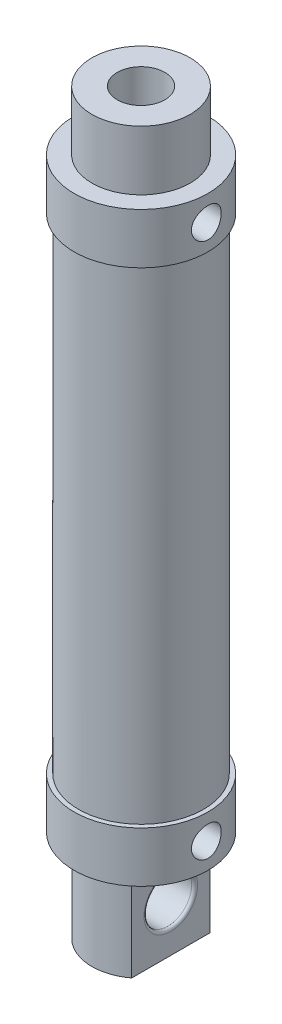
ISO-10303-21;
HEADER;
FILE_DESCRIPTION(('STEP AP214'),'2;1');
FILE_NAME('part.step','',(''),(''),'','','');
FILE_SCHEMA(('AUTOMOTIVE_DESIGN { 1 0 10303 214 1 1 1 1 }'));
ENDSEC;
DATA;
#1=APPLICATION_CONTEXT('core data for automotive mechanical design processes');
#2=APPLICATION_PROTOCOL_DEFINITION('international standard','automotive_design',2000,#1);
#3=PRODUCT_CONTEXT('',#1,'mechanical');
#4=PRODUCT('Part','Part','',(#3));
#5=PRODUCT_RELATED_PRODUCT_CATEGORY('part','',(#4));
#6=PRODUCT_DEFINITION_FORMATION('','',#4);
#7=PRODUCT_DEFINITION_CONTEXT('part definition',#1,'design');
#8=PRODUCT_DEFINITION('design','',#6,#7);
#9=PRODUCT_DEFINITION_SHAPE('','',#8);
#10=(LENGTH_UNIT() NAMED_UNIT(*) SI_UNIT(.MILLI.,.METRE.));
#11=(NAMED_UNIT(*) PLANE_ANGLE_UNIT() SI_UNIT($,.RADIAN.));
#12=(NAMED_UNIT(*) SI_UNIT($,.STERADIAN.) SOLID_ANGLE_UNIT());
#13=UNCERTAINTY_MEASURE_WITH_UNIT(LENGTH_MEASURE(1.E-05),#10,'distance_accuracy_value','');
#14=(GEOMETRIC_REPRESENTATION_CONTEXT(3) GLOBAL_UNCERTAINTY_ASSIGNED_CONTEXT((#13)) GLOBAL_UNIT_ASSIGNED_CONTEXT((#10,
#11,#12)) REPRESENTATION_CONTEXT('',''));
#15=CARTESIAN_POINT('',(0.,0.,0.));
#16=DIRECTION('',(0.,0.,1.));
#17=DIRECTION('',(1.,0.,0.));
#18=AXIS2_PLACEMENT_3D('',#15,#16,#17);
#19=CARTESIAN_POINT('',(0.,180.,0.));
#20=DIRECTION('',(0.,1.,0.));
#21=DIRECTION('',(0.,0.,-1.));
#22=AXIS2_PLACEMENT_3D('',#19,#20,#21);
#23=PLANE('',#22);
#24=CARTESIAN_POINT('',(0.,180.,0.));
#25=DIRECTION('',(0.,-1.,0.));
#26=DIRECTION('',(0.,0.,-1.));
#27=AXIS2_PLACEMENT_3D('',#24,#25,#26);
#28=CIRCLE('',#27,22.5);
#29=CARTESIAN_POINT('',(0.,180.,-22.5));
#30=VERTEX_POINT('',#29);
#31=EDGE_CURVE('E113',#30,#30,#28,.T.);
#32=ORIENTED_EDGE('',*,*,#31,.F.);
#33=EDGE_LOOP('',(#32));
#34=FACE_BOUND('',#33,.T.);
#35=CARTESIAN_POINT('',(0.,180.,0.));
#36=DIRECTION('',(0.,1.,0.));
#37=DIRECTION('',(0.,0.,1.));
#38=AXIS2_PLACEMENT_3D('',#35,#36,#37);
#39=CIRCLE('',#38,16.5);
#40=CARTESIAN_POINT('',(0.,180.,16.5));
#41=VERTEX_POINT('',#40);
#42=EDGE_CURVE('E260',#41,#41,#39,.T.);
#43=ORIENTED_EDGE('',*,*,#42,.F.);
#44=EDGE_LOOP('',(#43));
#45=FACE_BOUND('',#44,.T.);
#46=ADVANCED_FACE('F34',(#34,#45),#23,.T.);
#47=CARTESIAN_POINT('',(0.,-17.,0.));
#48=DIRECTION('',(0.,-1.,0.));
#49=DIRECTION('',(0.,0.,-1.));
#50=AXIS2_PLACEMENT_3D('',#47,#48,#49);
#51=PLANE('',#50);
#52=CARTESIAN_POINT('',(0.,-17.,0.));
#53=DIRECTION('',(0.,-1.,0.));
#54=DIRECTION('',(0.,0.,-1.));
#55=AXIS2_PLACEMENT_3D('',#52,#53,#54);
#56=CIRCLE('',#55,22.5);
#57=CARTESIAN_POINT('',(0.,-17.,-22.5));
#58=VERTEX_POINT('',#57);
#59=EDGE_CURVE('E125',#58,#58,#56,.T.);
#60=ORIENTED_EDGE('',*,*,#59,.T.);
#61=EDGE_LOOP('',(#60));
#62=FACE_BOUND('',#61,.T.);
#63=DIRECTION('',(0.,0.,1.));
#64=VECTOR('',#63,1.);
#65=CARTESIAN_POINT('',(10.,-17.,-13.1244047484067));
#66=LINE('',#65,#64);
#67=CARTESIAN_POINT('',(10.,-17.,-13.1244047484067));
#68=VERTEX_POINT('',#67);
#69=CARTESIAN_POINT('',(10.,-17.,13.1244047484067));
#70=VERTEX_POINT('',#69);
#71=EDGE_CURVE('E90',#68,#70,#66,.T.);
#72=ORIENTED_EDGE('',*,*,#71,.F.);
#73=CARTESIAN_POINT('',(0.,-17.,0.));
#74=DIRECTION('',(0.,-1.,0.));
#75=DIRECTION('',(0.,0.,-1.));
#76=AXIS2_PLACEMENT_3D('',#73,#74,#75);
#77=CIRCLE('',#76,16.5);
#78=CARTESIAN_POINT('',(-10.,-17.,-13.1244047484067));
#79=VERTEX_POINT('',#78);
#80=EDGE_CURVE('E101',#79,#68,#77,.T.);
#81=ORIENTED_EDGE('',*,*,#80,.F.);
#82=DIRECTION('',(0.,0.,-1.));
#83=VECTOR('',#82,1.);
#84=CARTESIAN_POINT('',(-10.,-17.,-13.1244047484067));
#85=LINE('',#84,#83);
#86=CARTESIAN_POINT('',(-10.,-17.,13.1244047484067));
#87=VERTEX_POINT('',#86);
#88=EDGE_CURVE('E71',#87,#79,#85,.T.);
#89=ORIENTED_EDGE('',*,*,#88,.F.);
#90=CARTESIAN_POINT('',(0.,-17.,0.));
#91=DIRECTION('',(0.,-1.,0.));
#92=DIRECTION('',(0.,0.,-1.));
#93=AXIS2_PLACEMENT_3D('',#90,#91,#92);
#94=CIRCLE('',#93,16.5);
#95=EDGE_CURVE('E106',#70,#87,#94,.T.);
#96=ORIENTED_EDGE('',*,*,#95,.F.);
#97=EDGE_LOOP('',(#72,#81,#89,#96));
#98=FACE_BOUND('',#97,.T.);
#99=ADVANCED_FACE('F163',(#62,#98),#51,.T.);
#100=CARTESIAN_POINT('',(0.,180.,0.));
#101=DIRECTION('',(0.,-1.,0.));
#102=DIRECTION('',(0.,0.,-1.));
#103=AXIS2_PLACEMENT_3D('',#100,#101,#102);
#104=CYLINDRICAL_SURFACE('',#103,22.5);
#105=ORIENTED_EDGE('',*,*,#31,.T.);
#106=EDGE_LOOP('',(#105));
#107=FACE_BOUND('',#106,.T.);
#108=CARTESIAN_POINT('',(0.,163.,0.));
#109=DIRECTION('',(0.,-1.,0.));
#110=DIRECTION('',(0.,0.,-1.));
#111=AXIS2_PLACEMENT_3D('',#108,#109,#110);
#112=CIRCLE('',#111,22.5);
#113=CARTESIAN_POINT('',(0.,163.,-22.5));
#114=VERTEX_POINT('',#113);
#115=EDGE_CURVE('E112',#114,#114,#112,.T.);
#116=ORIENTED_EDGE('',*,*,#115,.F.);
#117=EDGE_LOOP('',(#116));
#118=FACE_BOUND('',#117,.T.);
#119=CARTESIAN_POINT('',(21.9374109684803,171.5,-5.));
#120=CARTESIAN_POINT('',(21.9374165661433,171.22289408071,-4.99999062369871));
#121=CARTESIAN_POINT('',(21.942718633996,170.945676468354,-4.97688532864164));
#122=CARTESIAN_POINT('',(21.9633134762853,170.399132934778,-4.88518059165713));
#123=CARTESIAN_POINT('',(21.9786133234432,170.12981274146,-4.81654894253562));
#124=CARTESIAN_POINT('',(22.0173873094191,169.607048944326,-4.63606595780698));
#125=CARTESIAN_POINT('',(22.0408523106148,169.353587964999,-4.52426292001524));
#126=CARTESIAN_POINT('',(22.0933016577055,168.869012482357,-4.26075008588277));
#127=CARTESIAN_POINT('',(22.1222859274126,168.637897670643,-4.1090408403953));
#128=CARTESIAN_POINT('',(22.1830725820844,168.200543571579,-3.76720268647807));
#129=CARTESIAN_POINT('',(22.2149119956476,167.994750594701,-3.57650924448048));
#130=CARTESIAN_POINT('',(22.277497586179,167.617793118902,-3.16333419715912));
#131=CARTESIAN_POINT('',(22.3082436762984,167.446631365891,-2.94085007353794));
#132=CARTESIAN_POINT('',(22.3655823200431,167.142023121512,-2.46740986309392));
#133=CARTESIAN_POINT('',(22.3921260851858,167.009006876367,-2.2161705413327));
#134=CARTESIAN_POINT('',(22.4376506083871,166.787250495699,-1.69421583912987));
#135=CARTESIAN_POINT('',(22.4566322429044,166.698505228822,-1.42350272001739));
#136=CARTESIAN_POINT('',(22.4846321116813,166.569216417653,-0.874926990820835));
#137=CARTESIAN_POINT('',(22.4938063731733,166.527917226999,-0.597250570654805));
#138=CARTESIAN_POINT('',(22.501698723801,166.492329322819,-0.0387691444650578));
#139=CARTESIAN_POINT('',(22.5004180460737,166.498035065165,0.242035488691364));
#140=CARTESIAN_POINT('',(22.4876637337819,166.55573430624,0.79358980233586));
#141=CARTESIAN_POINT('',(22.4763694901164,166.606913197728,1.06442946081786));
#142=CARTESIAN_POINT('',(22.4450619325581,166.752806668888,1.59357711385855));
#143=CARTESIAN_POINT('',(22.4250482162022,166.847523258133,1.85188452935707));
#144=CARTESIAN_POINT('',(22.3782634651396,167.078517435252,2.35088442347728));
#145=CARTESIAN_POINT('',(22.3514428138133,167.215101791361,2.59143005223487));
#146=CARTESIAN_POINT('',(22.293981792107,167.525725234873,3.04648284136218));
#147=CARTESIAN_POINT('',(22.2633408860234,167.699769577676,3.26098634157449));
#148=CARTESIAN_POINT('',(22.2008291431457,168.084800484631,3.66271247395139));
#149=CARTESIAN_POINT('',(22.1689460239096,168.296499939921,3.84925054618799));
#150=CARTESIAN_POINT('',(22.1081580361397,168.748506869048,4.18430757551619));
#151=CARTESIAN_POINT('',(22.0792532537017,168.988815169457,4.3328254337298));
#152=CARTESIAN_POINT('',(22.027660838775,169.492349720856,4.58794414789231));
#153=CARTESIAN_POINT('',(22.0049930107585,169.755645556943,4.69441193598692));
#154=CARTESIAN_POINT('',(21.9687128511933,170.297015428135,4.86138173804741));
#155=CARTESIAN_POINT('',(21.9550990318597,170.575087027123,4.92189130425381));
#156=CARTESIAN_POINT('',(21.9387727122218,171.131849967674,4.99415747251352));
#157=CARTESIAN_POINT('',(21.9358370046809,171.410405327621,5.00691246919605));
#158=CARTESIAN_POINT('',(21.9405966113852,171.965662307414,4.98601368560592));
#159=CARTESIAN_POINT('',(21.9482911698352,172.242364057643,4.95236320469018));
#160=CARTESIAN_POINT('',(21.973233207339,172.782558843734,4.84047593306879));
#161=CARTESIAN_POINT('',(21.9903620918494,173.046172438239,4.7627923163612));
#162=CARTESIAN_POINT('',(22.0321352125226,173.556641577824,4.56564437846772));
#163=CARTESIAN_POINT('',(22.0567801869623,173.803495473749,4.44617595275022));
#164=CARTESIAN_POINT('',(22.1112968513251,174.277749004441,4.1666617541638));
#165=CARTESIAN_POINT('',(22.1412451911085,174.504778287463,4.00600286177112));
#166=CARTESIAN_POINT('',(22.2027935503206,174.929020893522,3.64946760734427));
#167=CARTESIAN_POINT('',(22.2343937814343,175.126230382571,3.45358672382732));
#168=CARTESIAN_POINT('',(22.2964233481837,175.489128358771,3.02764303653655));
#169=CARTESIAN_POINT('',(22.3268183182885,175.654135089674,2.79699352459069));
#170=CARTESIAN_POINT('',(22.3823727860854,175.943060335585,2.31067040535647));
#171=CARTESIAN_POINT('',(22.4075325323521,176.066980801584,2.05499798703266));
#172=CARTESIAN_POINT('',(22.4496372179897,176.269275286584,1.52750475000824));
#173=CARTESIAN_POINT('',(22.4666350054648,176.347942989735,1.25580097043602));
#174=CARTESIAN_POINT('',(22.4907294174878,176.458412900041,0.702612716988976));
#175=CARTESIAN_POINT('',(22.4978275303209,176.490222151785,0.421129719812964));
#176=CARTESIAN_POINT('',(22.501276880007,176.505746955922,-0.137162113850936));
#177=CARTESIAN_POINT('',(22.4978552807622,176.490479076648,-0.413941764340498));
#178=CARTESIAN_POINT('',(22.481138161578,176.414562623608,-0.960885103415379));
#179=CARTESIAN_POINT('',(22.4678428303716,176.353914917262,-1.23104891835823));
#180=CARTESIAN_POINT('',(22.4328909266112,176.189454107013,-1.75627571196661));
#181=CARTESIAN_POINT('',(22.4112631248155,176.085789440248,-2.01138720660136));
#182=CARTESIAN_POINT('',(22.3619521829452,175.838380491151,-2.50072882023259));
#183=CARTESIAN_POINT('',(22.3342684349331,175.694632184549,-2.73495683947676));
#184=CARTESIAN_POINT('',(22.2751870653884,175.367844306342,-3.18082724877494));
#185=CARTESIAN_POINT('',(22.2437274871573,175.184092410776,-3.39193939598233));
#186=CARTESIAN_POINT('',(22.1809676794422,174.783944658869,-3.78067933088269));
#187=CARTESIAN_POINT('',(22.1496674903786,174.567540910525,-3.95829899997864));
#188=CARTESIAN_POINT('',(22.0902842541619,174.10461375053,-4.27739627854961));
#189=CARTESIAN_POINT('',(22.0622519776713,173.857713458148,-4.41833714644939));
#190=CARTESIAN_POINT('',(22.0132210046623,173.343157761572,-4.65650065811668));
#191=CARTESIAN_POINT('',(21.9922164448483,173.075519889736,-4.75375976933249));
#192=CARTESIAN_POINT('',(21.9634405435101,172.589733814862,-4.88473373664338));
#193=CARTESIAN_POINT('',(21.9537451128599,172.374191431816,-4.92787455119963));
#194=CARTESIAN_POINT('',(21.9407282728786,171.93912260855,-4.98551065426522));
#195=CARTESIAN_POINT('',(21.9374065325357,171.719596375824,-5.0000074303782));
#196=CARTESIAN_POINT('',(21.9374109684803,171.5,-5.));
#197=B_SPLINE_CURVE_WITH_KNOTS('',3,(#119,#120,#121,#122,#123,#124,#125,#126,#127,#128,#129,
#130,#131,#132,#133,#134,#135,#136,#137,#138,#139,#140,#141,#142,#143,#144,#145,#146,#147,#148,
#149,#150,#151,#152,#153,#154,#155,#156,#157,#158,#159,#160,#161,#162,#163,#164,#165,#166,#167,
#168,#169,#170,#171,#172,#173,#174,#175,#176,#177,#178,#179,#180,#181,#182,#183,#184,#185,#186,
#187,#188,#189,#190,#191,#192,#193,#194,#195,#196),.UNSPECIFIED.,.T.,.F.,(4,2,2,2,2,2,2,2,2,2,2,
2,2,2,2,2,2,2,2,2,2,2,2,2,2,2,2,2,2,2,2,2,2,2,2,2,2,2,4),(0.,0.830512792551669,1.66161375111474,
2.49178760019456,3.32194999040622,4.16511484799107,5.00834653390753,5.86074531607021,
6.71304527558167,7.55157428697474,8.39000439715204,9.21371104602281,10.0374557186008,
10.8673864501624,11.6974336917522,12.5453011824495,13.3931931758434,14.2437472362749,
15.0941614962701,15.9266937379832,16.759166791007,17.5814064488659,18.403726898214,
19.239080718276,20.0745418502129,20.9261261511868,21.7776700087199,22.6236232364894,
23.4694492726586,24.29713968923,25.1248142851825,25.9496562945819,26.7745811453329,
27.6156117364682,28.4568459325905,29.309774288485,30.1619892526914,30.8201746575815,
31.4783258792768),.UNSPECIFIED.);
#198=CARTESIAN_POINT('',(21.9374109684803,171.5,-5.));
#199=VERTEX_POINT('',#198);
#200=EDGE_CURVE('E146',#199,#199,#197,.T.);
#201=ORIENTED_EDGE('',*,*,#200,.T.);
#202=EDGE_LOOP('',(#201));
#203=FACE_BOUND('',#202,.T.);
#204=ADVANCED_FACE('F165',(#107,#118,#203),#104,.T.);
#205=CARTESIAN_POINT('',(0.,163.,0.));
#206=DIRECTION('',(0.,-1.,0.));
#207=DIRECTION('',(0.,0.,-1.));
#208=AXIS2_PLACEMENT_3D('',#205,#206,#207);
#209=CYLINDRICAL_SURFACE('',#208,21.);
#210=CARTESIAN_POINT('',(0.,163.,0.));
#211=DIRECTION('',(0.,1.,0.));
#212=DIRECTION('',(0.,0.,1.));
#213=AXIS2_PLACEMENT_3D('',#210,#211,#212);
#214=CIRCLE('',#213,21.);
#215=CARTESIAN_POINT('',(0.,163.,21.));
#216=VERTEX_POINT('',#215);
#217=EDGE_CURVE('E136',#216,#216,#214,.T.);
#218=ORIENTED_EDGE('',*,*,#217,.F.);
#219=EDGE_LOOP('',(#218));
#220=FACE_BOUND('',#219,.T.);
#221=CARTESIAN_POINT('',(0.,0.,0.));
#222=DIRECTION('',(0.,-1.,0.));
#223=DIRECTION('',(0.,0.,-1.));
#224=AXIS2_PLACEMENT_3D('',#221,#222,#223);
#225=CIRCLE('',#224,21.);
#226=CARTESIAN_POINT('',(0.,0.,-21.));
#227=VERTEX_POINT('',#226);
#228=EDGE_CURVE('E128',#227,#227,#225,.T.);
#229=ORIENTED_EDGE('',*,*,#228,.F.);
#230=EDGE_LOOP('',(#229));
#231=FACE_BOUND('',#230,.T.);
#232=ADVANCED_FACE('F183',(#220,#231),#209,.T.);
#233=CARTESIAN_POINT('',(0.,0.,0.));
#234=DIRECTION('',(0.,-1.,0.));
#235=DIRECTION('',(0.,0.,-1.));
#236=AXIS2_PLACEMENT_3D('',#233,#234,#235);
#237=PLANE('',#236);
#238=CARTESIAN_POINT('',(0.,0.,0.));
#239=DIRECTION('',(0.,-1.,0.));
#240=DIRECTION('',(0.,0.,-1.));
#241=AXIS2_PLACEMENT_3D('',#238,#239,#240);
#242=CIRCLE('',#241,22.5);
#243=CARTESIAN_POINT('',(0.,0.,-22.5));
#244=VERTEX_POINT('',#243);
#245=EDGE_CURVE('E124',#244,#244,#242,.T.);
#246=ORIENTED_EDGE('',*,*,#245,.F.);
#247=EDGE_LOOP('',(#246));
#248=FACE_BOUND('',#247,.T.);
#249=ORIENTED_EDGE('',*,*,#228,.T.);
#250=EDGE_LOOP('',(#249));
#251=FACE_BOUND('',#250,.T.);
#252=ADVANCED_FACE('F172',(#248,#251),#237,.F.);
#253=CARTESIAN_POINT('',(0.,-17.,0.));
#254=DIRECTION('',(0.,1.,0.));
#255=DIRECTION('',(0.,0.,1.));
#256=AXIS2_PLACEMENT_3D('',#253,#254,#255);
#257=CYLINDRICAL_SURFACE('',#256,22.5);
#258=CARTESIAN_POINT('',(21.9374109684803,-8.5,-5.));
#259=CARTESIAN_POINT('',(21.9374165661433,-8.77710591928998,-4.99999062369871));
#260=CARTESIAN_POINT('',(21.942718633996,-9.0543235316462,-4.97688532864164));
#261=CARTESIAN_POINT('',(21.9633134762853,-9.60086706522218,-4.88518059165714));
#262=CARTESIAN_POINT('',(21.9786133234432,-9.87018725853995,-4.81654894253563));
#263=CARTESIAN_POINT('',(22.0173873094191,-10.3929510556742,-4.63606595780699));
#264=CARTESIAN_POINT('',(22.0408523106148,-10.646412035001,-4.52426292001524));
#265=CARTESIAN_POINT('',(22.0933016577055,-11.1309875176428,-4.26075008588278));
#266=CARTESIAN_POINT('',(22.1222859274126,-11.3621023293574,-4.1090408403953));
#267=CARTESIAN_POINT('',(22.1830725820844,-11.799456428421,-3.76720268647808));
#268=CARTESIAN_POINT('',(22.2149119956476,-12.0052494052993,-3.57650924448049));
#269=CARTESIAN_POINT('',(22.277497586179,-12.3822068810976,-3.16333419715912));
#270=CARTESIAN_POINT('',(22.3082436762984,-12.5533686341091,-2.94085007353794));
#271=CARTESIAN_POINT('',(22.3655823200431,-12.8579768784883,-2.46740986309391));
#272=CARTESIAN_POINT('',(22.3921260851858,-12.9909931236328,-2.21617054133269));
#273=CARTESIAN_POINT('',(22.4376506083871,-13.2127495043012,-1.69421583912986));
#274=CARTESIAN_POINT('',(22.4566322429044,-13.3014947711775,-1.42350272001738));
#275=CARTESIAN_POINT('',(22.4846321116813,-13.4307835823471,-0.874926990820837));
#276=CARTESIAN_POINT('',(22.4938063731733,-13.472082773001,-0.597250570654805));
#277=CARTESIAN_POINT('',(22.501698723801,-13.5076706771811,-0.0387691444650559));
#278=CARTESIAN_POINT('',(22.5004180460737,-13.5019649348345,0.242035488691367));
#279=CARTESIAN_POINT('',(22.4876637337819,-13.4442656937599,0.793589802335865));
#280=CARTESIAN_POINT('',(22.4763694901164,-13.3930868022723,1.06442946081787));
#281=CARTESIAN_POINT('',(22.4450619325581,-13.2471933311121,1.59357711385856));
#282=CARTESIAN_POINT('',(22.4250482162021,-13.1524767418668,1.85188452935707));
#283=CARTESIAN_POINT('',(22.3782634651396,-12.9214825647477,2.35088442347728));
#284=CARTESIAN_POINT('',(22.3514428138133,-12.7848982086393,2.59143005223488));
#285=CARTESIAN_POINT('',(22.293981792107,-12.4742747651271,3.0464828413622));
#286=CARTESIAN_POINT('',(22.2633408860234,-12.3002304223236,3.2609863415745));
#287=CARTESIAN_POINT('',(22.2008291431457,-11.9151995153691,3.6627124739514));
#288=CARTESIAN_POINT('',(22.1689460239096,-11.7035000600785,3.849250546188));
#289=CARTESIAN_POINT('',(22.1081580361397,-11.2514931309517,4.1843075755162));
#290=CARTESIAN_POINT('',(22.0792532537017,-11.0111848305433,4.3328254337298));
#291=CARTESIAN_POINT('',(22.027660838775,-10.5076502791445,4.58794414789231));
#292=CARTESIAN_POINT('',(22.0049930107585,-10.2443544430568,4.69441193598692));
#293=CARTESIAN_POINT('',(21.9687128511933,-9.70298457186509,4.86138173804741));
#294=CARTESIAN_POINT('',(21.9550990318597,-9.42491297287739,4.92189130425381));
#295=CARTESIAN_POINT('',(21.9387727122218,-8.86815003232613,4.99415747251352));
#296=CARTESIAN_POINT('',(21.9358370046809,-8.5895946723793,5.00691246919605));
#297=CARTESIAN_POINT('',(21.9405966113852,-8.03433769258617,4.98601368560592));
#298=CARTESIAN_POINT('',(21.9482911698352,-7.75763594235657,4.95236320469018));
#299=CARTESIAN_POINT('',(21.973233207339,-7.21744115626593,4.84047593306879));
#300=CARTESIAN_POINT('',(21.9903620918494,-6.95382756176125,4.76279231636121));
#301=CARTESIAN_POINT('',(22.0321352125226,-6.44335842217631,4.56564437846772));
#302=CARTESIAN_POINT('',(22.0567801869623,-6.19650452625082,4.44617595275022));
#303=CARTESIAN_POINT('',(22.1112968513251,-5.72225099555949,4.1666617541638));
#304=CARTESIAN_POINT('',(22.1412451911085,-5.49522171253748,4.00600286177112));
#305=CARTESIAN_POINT('',(22.2027935503206,-5.07097910647812,3.64946760734428));
#306=CARTESIAN_POINT('',(22.2343937814343,-4.87376961742851,3.45358672382733));
#307=CARTESIAN_POINT('',(22.2964233481837,-4.51087164122856,3.02764303653655));
#308=CARTESIAN_POINT('',(22.3268183182885,-4.34586491032636,2.79699352459069));
#309=CARTESIAN_POINT('',(22.3823727860854,-4.05693966441495,2.31067040535647));
#310=CARTESIAN_POINT('',(22.4075325323521,-3.93301919841639,2.05499798703265));
#311=CARTESIAN_POINT('',(22.4496372179897,-3.73072471341648,1.52750475000824));
#312=CARTESIAN_POINT('',(22.4666350054648,-3.65205701026459,1.25580097043601));
#313=CARTESIAN_POINT('',(22.4907294174878,-3.54158709995867,0.702612716988973));
#314=CARTESIAN_POINT('',(22.4978275303209,-3.50977784821539,0.421129719812965));
#315=CARTESIAN_POINT('',(22.501276880007,-3.4942530440776,-0.137162113850932));
#316=CARTESIAN_POINT('',(22.4978552807622,-3.50952092335184,-0.413941764340495));
#317=CARTESIAN_POINT('',(22.481138161578,-3.58543737639187,-0.960885103415378));
#318=CARTESIAN_POINT('',(22.4678428303716,-3.64608508273759,-1.23104891835822));
#319=CARTESIAN_POINT('',(22.4328909266112,-3.81054589298678,-1.75627571196661));
#320=CARTESIAN_POINT('',(22.4112631248155,-3.91421055975179,-2.01138720660136));
#321=CARTESIAN_POINT('',(22.3619521829452,-4.16161950884863,-2.50072882023259));
#322=CARTESIAN_POINT('',(22.3342684349331,-4.30536781545056,-2.73495683947675));
#323=CARTESIAN_POINT('',(22.2751870653884,-4.63215569365768,-3.18082724877495));
#324=CARTESIAN_POINT('',(22.2437274871573,-4.81590758922361,-3.39193939598236));
#325=CARTESIAN_POINT('',(22.1809676794422,-5.21605534113089,-3.78067933088271));
#326=CARTESIAN_POINT('',(22.1496674903786,-5.43245908947523,-3.95829899997864));
#327=CARTESIAN_POINT('',(22.0902842541619,-5.89538624946988,-4.2773962785496));
#328=CARTESIAN_POINT('',(22.0622519776713,-6.14228654185171,-4.41833714644937));
#329=CARTESIAN_POINT('',(22.0132210046623,-6.65684223842792,-4.65650065811667));
#330=CARTESIAN_POINT('',(21.9922164448483,-6.92448011026414,-4.75375976933248));
#331=CARTESIAN_POINT('',(21.9634405435101,-7.41026618513813,-4.88473373664338));
#332=CARTESIAN_POINT('',(21.9537451128599,-7.62580856818372,-4.92787455119963));
#333=CARTESIAN_POINT('',(21.9407282728786,-8.06087739145043,-4.98551065426522));
#334=CARTESIAN_POINT('',(21.9374065325357,-8.28040362417614,-5.0000074303782));
#335=CARTESIAN_POINT('',(21.9374109684803,-8.5,-5.));
#336=B_SPLINE_CURVE_WITH_KNOTS('',3,(#258,#259,#260,#261,#262,#263,#264,#265,#266,#267,#268,
#269,#270,#271,#272,#273,#274,#275,#276,#277,#278,#279,#280,#281,#282,#283,#284,#285,#286,#287,
#288,#289,#290,#291,#292,#293,#294,#295,#296,#297,#298,#299,#300,#301,#302,#303,#304,#305,#306,
#307,#308,#309,#310,#311,#312,#313,#314,#315,#316,#317,#318,#319,#320,#321,#322,#323,#324,#325,
#326,#327,#328,#329,#330,#331,#332,#333,#334,#335),.UNSPECIFIED.,.T.,.F.,(4,2,2,2,2,2,2,2,2,2,2,
2,2,2,2,2,2,2,2,2,2,2,2,2,2,2,2,2,2,2,2,2,2,2,2,2,2,2,4),(0.,0.830512792551633,1.66161375111474,
2.49178760019452,3.3219499904062,4.16511484799107,5.00834653390754,5.86074531607022,
6.71304527558167,7.55157428697474,8.39000439715204,9.21371104602282,10.0374557186008,
10.8673864501624,11.6974336917522,12.5453011824495,13.3931931758434,14.2437472362749,
15.0941614962701,15.9266937379832,16.759166791007,17.5814064488659,18.403726898214,
19.239080718276,20.0745418502128,20.9261261511868,21.7776700087199,22.6236232364894,
23.4694492726586,24.29713968923,25.1248142851825,25.9496562945819,26.7745811453329,
27.6156117364682,28.4568459325905,29.3097742884849,30.1619892526914,30.8201746575815,
31.4783258792768),.UNSPECIFIED.);
#337=CARTESIAN_POINT('',(21.9374109684803,-8.5,-5.));
#338=VERTEX_POINT('',#337);
#339=EDGE_CURVE('E139',#338,#338,#336,.T.);
#340=ORIENTED_EDGE('',*,*,#339,.T.);
#341=EDGE_LOOP('',(#340));
#342=FACE_BOUND('',#341,.T.);
#343=ORIENTED_EDGE('',*,*,#59,.F.);
#344=EDGE_LOOP('',(#343));
#345=FACE_BOUND('',#344,.T.);
#346=ORIENTED_EDGE('',*,*,#245,.T.);
#347=EDGE_LOOP('',(#346));
#348=FACE_BOUND('',#347,.T.);
#349=ADVANCED_FACE('F152',(#342,#345,#348),#257,.T.);
#350=CARTESIAN_POINT('',(5.5,-8.5,0.));
#351=DIRECTION('',(1.,0.,0.));
#352=DIRECTION('',(0.,0.,-1.));
#353=AXIS2_PLACEMENT_3D('',#350,#351,#352);
#354=CYLINDRICAL_SURFACE('',#353,5.);
#355=CARTESIAN_POINT('',(5.5,-8.5,0.));
#356=DIRECTION('',(1.,0.,0.));
#357=DIRECTION('',(0.,0.,-1.));
#358=AXIS2_PLACEMENT_3D('',#355,#356,#357);
#359=CIRCLE('',#358,5.);
#360=CARTESIAN_POINT('',(5.5,-8.5,-5.));
#361=VERTEX_POINT('',#360);
#362=EDGE_CURVE('E121',#361,#361,#359,.T.);
#363=ORIENTED_EDGE('',*,*,#362,.F.);
#364=EDGE_LOOP('',(#363));
#365=FACE_BOUND('',#364,.T.);
#366=ORIENTED_EDGE('',*,*,#339,.F.);
#367=EDGE_LOOP('',(#366));
#368=FACE_BOUND('',#367,.T.);
#369=ADVANCED_FACE('F156',(#365,#368),#354,.F.);
#370=CARTESIAN_POINT('',(5.5,-8.5,0.));
#371=DIRECTION('',(1.,0.,0.));
#372=DIRECTION('',(0.,0.,-1.));
#373=AXIS2_PLACEMENT_3D('',#370,#371,#372);
#374=PLANE('',#373);
#375=ORIENTED_EDGE('',*,*,#362,.T.);
#376=EDGE_LOOP('',(#375));
#377=FACE_BOUND('',#376,.T.);
#378=ADVANCED_FACE('F161',(#377),#374,.T.);
#379=CARTESIAN_POINT('',(0.,163.,0.));
#380=DIRECTION('',(0.,1.,0.));
#381=DIRECTION('',(0.,0.,-1.));
#382=AXIS2_PLACEMENT_3D('',#379,#380,#381);
#383=PLANE('',#382);
#384=ORIENTED_EDGE('',*,*,#115,.T.);
#385=EDGE_LOOP('',(#384));
#386=FACE_BOUND('',#385,.T.);
#387=ORIENTED_EDGE('',*,*,#217,.T.);
#388=EDGE_LOOP('',(#387));
#389=FACE_BOUND('',#388,.T.);
#390=ADVANCED_FACE('F198',(#386,#389),#383,.F.);
#391=CARTESIAN_POINT('',(5.5,171.5,0.));
#392=DIRECTION('',(1.,0.,0.));
#393=DIRECTION('',(0.,0.,-1.));
#394=AXIS2_PLACEMENT_3D('',#391,#392,#393);
#395=CYLINDRICAL_SURFACE('',#394,5.);
#396=CARTESIAN_POINT('',(6.2449979983984,171.5,-5.));
#397=CARTESIAN_POINT('',(6.24499999083318,171.375690002915,-4.99999874728376));
#398=CARTESIAN_POINT('',(6.24872594235152,171.251356088078,-4.99535477639502));
#399=CARTESIAN_POINT('',(6.26346233698877,171.003757654782,-4.97686385741702));
#400=CARTESIAN_POINT('',(6.27447707053878,170.880493809526,-4.96301148892208));
#401=CARTESIAN_POINT('',(6.30332817855701,170.635867105892,-4.92631685582623));
#402=CARTESIAN_POINT('',(6.32117831167981,170.514508598929,-4.90345645667282));
#403=CARTESIAN_POINT('',(6.36295500797281,170.274781539973,-4.84912073775945));
#404=CARTESIAN_POINT('',(6.38688460836052,170.156414515075,-4.81764111134032));
#405=CARTESIAN_POINT('',(6.4659871046767,169.80901714823,-4.71155634327381));
#406=CARTESIAN_POINT('',(6.52878844336902,169.585278408658,-4.6249307188155));
#407=CARTESIAN_POINT('',(6.66732308206753,169.155923708948,-4.42286683667303));
#408=CARTESIAN_POINT('',(6.7430567348088,168.950308243362,-4.30742779304937));
#409=CARTESIAN_POINT('',(6.91118002626908,168.532558586983,-4.03296948836379));
#410=CARTESIAN_POINT('',(7.00444112628931,168.323250470494,-3.87018134056584));
#411=CARTESIAN_POINT('',(7.19012524520994,167.93243974347,-3.51319765959104));
#412=CARTESIAN_POINT('',(7.28254746874407,167.750961359507,-3.3189750607162));
#413=CARTESIAN_POINT('',(7.41988971846401,167.492393738508,-2.99356128179165));
#414=CARTESIAN_POINT('',(7.46785190700924,167.404451706583,-2.87212880091628));
#415=CARTESIAN_POINT('',(7.55971876275305,167.239240482827,-2.62078661715025));
#416=CARTESIAN_POINT('',(7.60362512973125,167.161966813148,-2.49088050482954));
#417=CARTESIAN_POINT('',(7.68611478127736,167.018954631685,-2.2233377181538));
#418=CARTESIAN_POINT('',(7.72470066932016,166.953210473842,-2.08570487145726));
#419=CARTESIAN_POINT('',(7.79539753077302,166.834110863599,-1.80358193532005));
#420=CARTESIAN_POINT('',(7.82750968154026,166.780753158248,-1.65909309867122));
#421=CARTESIAN_POINT('',(7.88132879110576,166.692042581308,-1.37943032429725));
#422=CARTESIAN_POINT('',(7.90376135583818,166.655411358032,-1.24480106420071));
#423=CARTESIAN_POINT('',(7.94191844310851,166.593405724506,-0.972050692903721));
#424=CARTESIAN_POINT('',(7.95764407963578,166.568029444833,-0.83393016562646));
#425=CARTESIAN_POINT('',(7.98191012055643,166.528971611758,-0.555534462309639));
#426=CARTESIAN_POINT('',(7.9904564434862,166.515280425163,-0.415261158337205));
#427=CARTESIAN_POINT('',(8.00011955525847,166.499804914647,-0.133810084943788));
#428=CARTESIAN_POINT('',(8.00123719925945,166.498019220217,0.00736757849819063));
#429=CARTESIAN_POINT('',(7.99636544353032,166.50581693158,0.270239609899357));
#430=CARTESIAN_POINT('',(7.99131217584322,166.513902772159,0.391999310072914));
#431=CARTESIAN_POINT('',(7.97573898833037,166.538900493108,0.634293592306118));
#432=CARTESIAN_POINT('',(7.96521743178982,166.555815016,0.754827796543408));
#433=CARTESIAN_POINT('',(7.93894787928476,166.598248043326,0.993750416290279));
#434=CARTESIAN_POINT('',(7.92320165200919,166.623763636118,1.11213954368101));
#435=CARTESIAN_POINT('',(7.88683283084566,166.683084639958,1.34607315554104));
#436=CARTESIAN_POINT('',(7.86620835217572,166.716893255322,1.46161652141071));
#437=CARTESIAN_POINT('',(7.79753837345255,166.830385932127,1.80341623892685));
#438=CARTESIAN_POINT('',(7.74273886956258,166.922069927087,2.02447250488059));
#439=CARTESIAN_POINT('',(7.6194209119633,167.133884392283,2.44811588786113));
#440=CARTESIAN_POINT('',(7.55089933332868,167.254021343246,2.65069878262929));
#441=CARTESIAN_POINT('',(7.39573414184525,167.536103319765,3.05883635403528));
#442=CARTESIAN_POINT('',(7.30789649394851,167.701390664535,3.2616234577039));
#443=CARTESIAN_POINT('',(7.12780216070677,168.060557403349,3.63842034253162));
#444=CARTESIAN_POINT('',(7.0355391870356,168.254478349966,3.8123875088261));
#445=CARTESIAN_POINT('',(6.89398778931582,168.578001939642,4.05999923159468));
#446=CARTESIAN_POINT('',(6.8434352903873,168.698968467453,4.14440430037546));
#447=CARTESIAN_POINT('',(6.74504990142271,168.948748859913,4.30267035241459));
#448=CARTESIAN_POINT('',(6.697217523353,169.077564192433,4.37652935467604));
#449=CARTESIAN_POINT('',(6.60608014442446,169.342290734318,4.51291782494083));
#450=CARTESIAN_POINT('',(6.5627675425284,169.478189434639,4.57546644816389));
#451=CARTESIAN_POINT('',(6.48238923774269,169.756692317556,4.68865167394018));
#452=CARTESIAN_POINT('',(6.44532349757937,169.899296460135,4.73928834757019));
#453=CARTESIAN_POINT('',(6.3879911088914,170.151915844484,4.81614194168603));
#454=CARTESIAN_POINT('',(6.36587062744548,170.260629894668,4.84527833481626));
#455=CARTESIAN_POINT('',(6.3267200135842,170.480640997988,4.89628944573215));
#456=CARTESIAN_POINT('',(6.30968872571675,170.591937458618,4.91816581196151));
#457=CARTESIAN_POINT('',(6.2813224765214,170.816345506852,4.95434333722363));
#458=CARTESIAN_POINT('',(6.26998098512218,170.929454859204,4.96865318123363));
#459=CARTESIAN_POINT('',(6.25339132178237,171.156841725333,4.98951663397229));
#460=CARTESIAN_POINT('',(6.24814339794355,171.271119286483,4.99606992689043));
#461=CARTESIAN_POINT('',(6.24394563972606,171.500213756327,5.00131530513999));
#462=CARTESIAN_POINT('',(6.2450091194138,171.615031294285,4.99999077198393));
#463=CARTESIAN_POINT('',(6.25342323341975,171.84411058984,4.98946310366482));
#464=CARTESIAN_POINT('',(6.26077617711313,171.958372127783,4.98025707456075));
#465=CARTESIAN_POINT('',(6.28148941326477,172.185492435642,4.95410620951326));
#466=CARTESIAN_POINT('',(6.29485173090554,172.298350719468,4.9371587646522));
#467=CARTESIAN_POINT('',(6.32708655414445,172.521903681947,4.89577944983111));
#468=CARTESIAN_POINT('',(6.34596133931529,172.632597445259,4.8713444833474));
#469=CARTESIAN_POINT('',(6.40919739263553,172.95674114316,4.78821642821577));
#470=CARTESIAN_POINT('',(6.46057720915496,173.166277727102,4.71921780239629));
#471=CARTESIAN_POINT('',(6.57662484324879,173.571186318304,4.55609149726004));
#472=CARTESIAN_POINT('',(6.64129737518288,173.76655326685,4.46195489902191));
#473=CARTESIAN_POINT('',(6.79148506979736,174.177205754778,4.23062377482242));
#474=CARTESIAN_POINT('',(6.87862419429456,174.389201951953,4.08864375810931));
#475=CARTESIAN_POINT('',(7.05576916354206,174.78876845286,3.77473221644173));
#476=CARTESIAN_POINT('',(7.14577790263997,174.976313057613,3.60276961587654));
#477=CARTESIAN_POINT('',(7.28444679190232,175.251094373854,3.30924585333204));
#478=CARTESIAN_POINT('',(7.33462309019927,175.347423083994,3.19677534649606));
#479=CARTESIAN_POINT('',(7.43214539316409,175.530232114982,2.96297696798616));
#480=CARTESIAN_POINT('',(7.47949245970997,175.616716141945,2.84165245789292));
#481=CARTESIAN_POINT('',(7.57009743381037,175.779125442762,2.59064393379979));
#482=CARTESIAN_POINT('',(7.61335451021153,175.855048571938,2.46095822963475));
#483=CARTESIAN_POINT('',(7.6945247517604,175.99544110369,2.19402109584829));
#484=CARTESIAN_POINT('',(7.73244126265914,176.059917683938,2.0567744786349));
#485=CARTESIAN_POINT('',(7.79976180045407,176.173139223744,1.78389488579449));
#486=CARTESIAN_POINT('',(7.82953658856127,176.222588936118,1.64864631402098));
#487=CARTESIAN_POINT('',(7.88249738910154,176.309882501737,1.37327166975243));
#488=CARTESIAN_POINT('',(7.90568721484266,176.347733072979,1.23314847311446));
#489=CARTESIAN_POINT('',(7.94476970960062,176.411210758879,0.949284871547776));
#490=CARTESIAN_POINT('',(7.96066874338031,176.436848535905,0.805547737630381));
#491=CARTESIAN_POINT('',(7.98468098207153,176.475476008123,0.515747890604412));
#492=CARTESIAN_POINT('',(7.99279547496113,176.488467795641,0.369685566273147));
#493=CARTESIAN_POINT('',(8.00036899836203,176.500591820477,0.0984542398463979));
#494=CARTESIAN_POINT('',(8.000930859058,176.501489997099,-0.0266091901107385));
#495=CARTESIAN_POINT('',(7.99619997327325,176.493918692266,-0.276384426548452));
#496=CARTESIAN_POINT('',(7.99090543949389,176.485446351047,-0.401096114033542));
#497=CARTESIAN_POINT('',(7.97459103015405,176.459254625897,-0.649105048465657));
#498=CARTESIAN_POINT('',(7.96357367253312,176.441539308695,-0.772402893113224));
#499=CARTESIAN_POINT('',(7.93607401526799,176.397098635439,-1.01678782002792));
#500=CARTESIAN_POINT('',(7.9195896082267,176.370369804858,-1.13787403075117));
#501=CARTESIAN_POINT('',(7.8822041771513,176.309335126117,-1.37276960676335));
#502=CARTESIAN_POINT('',(7.86147899328626,176.275329022964,-1.48668509743696));
#503=CARTESIAN_POINT('',(7.81571728202851,176.19961071567,-1.71105112688162));
#504=CARTESIAN_POINT('',(7.79067928081095,176.157895876856,-1.82150046585621));
#505=CARTESIAN_POINT('',(7.70981708144697,176.021797007853,-2.14674322952896));
#506=CARTESIAN_POINT('',(7.64821482975007,175.916411016602,-2.35561190892485));
#507=CARTESIAN_POINT('',(7.50700801995939,175.667346034031,-2.77466231937408));
#508=CARTESIAN_POINT('',(7.4261985810781,175.520827795178,-2.98273013480173));
#509=CARTESIAN_POINT('',(7.25734713757212,175.199697763073,-3.3728567963425));
#510=CARTESIAN_POINT('',(7.16929702745268,175.025054269891,-3.55488585185793));
#511=CARTESIAN_POINT('',(6.98001614835193,174.623528691333,-3.91489797533938));
#512=CARTESIAN_POINT('',(6.8787148928699,174.392745385526,-4.08851588919801));
#513=CARTESIAN_POINT('',(6.68699282488337,173.901442557954,-4.39509030747827));
#514=CARTESIAN_POINT('',(6.59656601160479,173.640939592304,-4.52806930044198));
#515=CARTESIAN_POINT('',(6.457191507431,173.154327602743,-4.72397005512005));
#516=CARTESIAN_POINT('',(6.40349524541686,172.933251859655,-4.79586701428077));
#517=CARTESIAN_POINT('',(6.33898756748729,172.593243626905,-4.88041603953428));
#518=CARTESIAN_POINT('',(6.32016868842666,172.478627920073,-4.90470355408433));
#519=CARTESIAN_POINT('',(6.28849738412124,172.24719366897,-4.94524770814463));
#520=CARTESIAN_POINT('',(6.27564188891545,172.130376290429,-4.96150848011389));
#521=CARTESIAN_POINT('',(6.25906589814134,171.927895086979,-4.9823903295282));
#522=CARTESIAN_POINT('',(6.25380210027527,171.842553322443,-4.98898701036639));
#523=CARTESIAN_POINT('',(6.24676702410079,171.671478227137,-4.99779282932784));
#524=CARTESIAN_POINT('',(6.24499662408472,171.585744803328,-5.00000086408101));
#525=CARTESIAN_POINT('',(6.2449979983984,171.5,-5.));
#526=B_SPLINE_CURVE_WITH_KNOTS('',3,(#396,#397,#398,#399,#400,#401,#402,#403,#404,#405,#406,
#407,#408,#409,#410,#411,#412,#413,#414,#415,#416,#417,#418,#419,#420,#421,#422,#423,#424,#425,
#426,#427,#428,#429,#430,#431,#432,#433,#434,#435,#436,#437,#438,#439,#440,#441,#442,#443,#444,
#445,#446,#447,#448,#449,#450,#451,#452,#453,#454,#455,#456,#457,#458,#459,#460,#461,#462,#463,
#464,#465,#466,#467,#468,#469,#470,#471,#472,#473,#474,#475,#476,#477,#478,#479,#480,#481,#482,
#483,#484,#485,#486,#487,#488,#489,#490,#491,#492,#493,#494,#495,#496,#497,#498,#499,#500,#501,
#502,#503,#504,#505,#506,#507,#508,#509,#510,#511,#512,#513,#514,#515,#516,#517,#518,#519,#520,
#521,#522,#523,#524,#525),.UNSPECIFIED.,.T.,.F.,(4,2,2,2,2,2,2,2,2,2,2,2,2,2,2,2,2,2,2,2,2,2,2,
2,2,2,2,2,2,2,2,2,2,2,2,2,2,2,2,2,2,2,2,2,2,2,2,2,2,2,2,2,2,2,2,2,2,2,2,2,2,2,2,2,4),(0.,
0.372830631717398,0.745880919988975,1.11968608457863,1.49367836553751,2.23437397247079,
2.97508978546023,3.81517657771245,4.65599058786117,5.12769727095078,5.59920535801264,
6.07048189652379,6.54167264805613,6.96500037161669,7.38825775501682,7.81116586693969,
8.23402529460409,8.59998197802635,8.96604825916239,9.33199074341862,9.6980748463939,
10.4313641163756,11.1648205684642,11.9895533165928,12.8154948839412,13.2827866246025,
13.7501660272479,14.2167463086996,14.6833238060681,15.0271003394338,15.3707987622619,
15.7141018213498,16.0574188576537,16.4014603870609,16.7456282964257,17.0899122787371,
17.4343388350077,18.111112962398,18.7881275281775,19.5940378131019,20.4007884080993,
20.8693475683426,21.337729748067,21.8062069071061,22.2743892571627,22.7148894158781,
23.1551339612148,23.5949934439159,24.0347801378503,24.4095092287059,24.7843527137741,
25.1590314139736,25.5338547106937,25.8954875601863,26.2572442370256,26.9801965139638,
27.7781872367985,28.5770837508034,29.4911341692986,30.4046778558641,31.1173375632651,
31.472952845656,31.8283848529182,32.0854860972178,32.3426519723746),.UNSPECIFIED.);
#527=CARTESIAN_POINT('',(6.2449979983984,171.5,-5.));
#528=VERTEX_POINT('',#527);
#529=EDGE_CURVE('E263',#528,#528,#526,.T.);
#530=ORIENTED_EDGE('',*,*,#529,.T.);
#531=EDGE_LOOP('',(#530));
#532=FACE_BOUND('',#531,.T.);
#533=ORIENTED_EDGE('',*,*,#200,.F.);
#534=EDGE_LOOP('',(#533));
#535=FACE_BOUND('',#534,.T.);
#536=ADVANCED_FACE('F193',(#532,#535),#395,.F.);
#537=CARTESIAN_POINT('',(0.,-48.,0.));
#538=DIRECTION('',(0.,1.,0.));
#539=DIRECTION('',(0.,0.,1.));
#540=AXIS2_PLACEMENT_3D('',#537,#538,#539);
#541=CYLINDRICAL_SURFACE('',#540,16.5);
#542=ORIENTED_EDGE('',*,*,#80,.T.);
#543=DIRECTION('',(0.,1.,0.));
#544=VECTOR('',#543,1.);
#545=CARTESIAN_POINT('',(10.,-48.,-13.1244047484067));
#546=LINE('',#545,#544);
#547=CARTESIAN_POINT('',(10.,-48.,-13.1244047484067));
#548=VERTEX_POINT('',#547);
#549=EDGE_CURVE('E93',#548,#68,#546,.T.);
#550=ORIENTED_EDGE('',*,*,#549,.F.);
#551=CARTESIAN_POINT('',(0.,-48.,0.));
#552=DIRECTION('',(0.,-1.,0.));
#553=DIRECTION('',(0.,0.,-1.));
#554=AXIS2_PLACEMENT_3D('',#551,#552,#553);
#555=CIRCLE('',#554,16.5);
#556=CARTESIAN_POINT('',(-10.,-48.,-13.1244047484067));
#557=VERTEX_POINT('',#556);
#558=EDGE_CURVE('E83',#557,#548,#555,.T.);
#559=ORIENTED_EDGE('',*,*,#558,.F.);
#560=DIRECTION('',(0.,1.,0.));
#561=VECTOR('',#560,1.);
#562=CARTESIAN_POINT('',(-10.,-48.,-13.1244047484067));
#563=LINE('',#562,#561);
#564=EDGE_CURVE('E97',#557,#79,#563,.T.);
#565=ORIENTED_EDGE('',*,*,#564,.T.);
#566=EDGE_LOOP('',(#542,#550,#559,#565));
#567=FACE_BOUND('',#566,.T.);
#568=ADVANCED_FACE('F249',(#567),#541,.T.);
#569=CARTESIAN_POINT('',(10.,-48.,-13.1244047484067));
#570=DIRECTION('',(-1.,0.,0.));
#571=DIRECTION('',(0.,0.,1.));
#572=AXIS2_PLACEMENT_3D('',#569,#570,#571);
#573=PLANE('',#572);
#574=CARTESIAN_POINT('',(10.,-32.,0.));
#575=DIRECTION('',(-1.,0.,0.));
#576=DIRECTION('',(0.,0.,1.));
#577=AXIS2_PLACEMENT_3D('',#574,#575,#576);
#578=CIRCLE('',#577,9.);
#579=CARTESIAN_POINT('',(10.,-32.,9.));
#580=VERTEX_POINT('',#579);
#581=EDGE_CURVE('E11',#580,#580,#578,.T.);
#582=ORIENTED_EDGE('',*,*,#581,.T.);
#583=EDGE_LOOP('',(#582));
#584=FACE_BOUND('',#583,.T.);
#585=ORIENTED_EDGE('',*,*,#71,.T.);
#586=DIRECTION('',(0.,1.,0.));
#587=VECTOR('',#586,1.);
#588=CARTESIAN_POINT('',(10.,-48.,13.1244047484067));
#589=LINE('',#588,#587);
#590=CARTESIAN_POINT('',(10.,-48.,13.1244047484067));
#591=VERTEX_POINT('',#590);
#592=EDGE_CURVE('E87',#591,#70,#589,.T.);
#593=ORIENTED_EDGE('',*,*,#592,.F.);
#594=DIRECTION('',(0.,0.,1.));
#595=VECTOR('',#594,1.);
#596=CARTESIAN_POINT('',(10.,-48.,-13.1244047484067));
#597=LINE('',#596,#595);
#598=EDGE_CURVE('E78',#548,#591,#597,.T.);
#599=ORIENTED_EDGE('',*,*,#598,.F.);
#600=ORIENTED_EDGE('',*,*,#549,.T.);
#601=EDGE_LOOP('',(#585,#593,#599,#600));
#602=FACE_BOUND('',#601,.T.);
#603=ADVANCED_FACE('F88',(#584,#602),#573,.F.);
#604=CARTESIAN_POINT('',(0.,-48.,0.));
#605=DIRECTION('',(0.,1.,0.));
#606=DIRECTION('',(0.,0.,1.));
#607=AXIS2_PLACEMENT_3D('',#604,#605,#606);
#608=CYLINDRICAL_SURFACE('',#607,16.5);
#609=ORIENTED_EDGE('',*,*,#95,.T.);
#610=DIRECTION('',(0.,1.,0.));
#611=VECTOR('',#610,1.);
#612=CARTESIAN_POINT('',(-10.,-48.,13.1244047484067));
#613=LINE('',#612,#611);
#614=CARTESIAN_POINT('',(-10.,-48.,13.1244047484067));
#615=VERTEX_POINT('',#614);
#616=EDGE_CURVE('E49',#615,#87,#613,.T.);
#617=ORIENTED_EDGE('',*,*,#616,.F.);
#618=CARTESIAN_POINT('',(0.,-48.,0.));
#619=DIRECTION('',(0.,-1.,0.));
#620=DIRECTION('',(0.,0.,-1.));
#621=AXIS2_PLACEMENT_3D('',#618,#619,#620);
#622=CIRCLE('',#621,16.5);
#623=EDGE_CURVE('E81',#591,#615,#622,.T.);
#624=ORIENTED_EDGE('',*,*,#623,.F.);
#625=ORIENTED_EDGE('',*,*,#592,.T.);
#626=EDGE_LOOP('',(#609,#617,#624,#625));
#627=FACE_BOUND('',#626,.T.);
#628=ADVANCED_FACE('F95',(#627),#608,.T.);
#629=CARTESIAN_POINT('',(-10.,-48.,-13.1244047484067));
#630=DIRECTION('',(1.,0.,0.));
#631=DIRECTION('',(0.,0.,-1.));
#632=AXIS2_PLACEMENT_3D('',#629,#630,#631);
#633=PLANE('',#632);
#634=CARTESIAN_POINT('',(-10.,-32.,0.));
#635=DIRECTION('',(1.,0.,0.));
#636=DIRECTION('',(0.,0.,-1.));
#637=AXIS2_PLACEMENT_3D('',#634,#635,#636);
#638=CIRCLE('',#637,9.);
#639=CARTESIAN_POINT('',(-10.,-32.,-9.));
#640=VERTEX_POINT('',#639);
#641=EDGE_CURVE('E213',#640,#640,#638,.T.);
#642=ORIENTED_EDGE('',*,*,#641,.T.);
#643=EDGE_LOOP('',(#642));
#644=FACE_BOUND('',#643,.T.);
#645=ORIENTED_EDGE('',*,*,#88,.T.);
#646=ORIENTED_EDGE('',*,*,#564,.F.);
#647=DIRECTION('',(0.,0.,-1.));
#648=VECTOR('',#647,1.);
#649=CARTESIAN_POINT('',(-10.,-48.,-13.1244047484067));
#650=LINE('',#649,#648);
#651=EDGE_CURVE('E57',#615,#557,#650,.T.);
#652=ORIENTED_EDGE('',*,*,#651,.F.);
#653=ORIENTED_EDGE('',*,*,#616,.T.);
#654=EDGE_LOOP('',(#645,#646,#652,#653));
#655=FACE_BOUND('',#654,.T.);
#656=ADVANCED_FACE('F239',(#644,#655),#633,.F.);
#657=CARTESIAN_POINT('',(0.,-48.,0.));
#658=DIRECTION('',(0.,-1.,0.));
#659=DIRECTION('',(0.,0.,-1.));
#660=AXIS2_PLACEMENT_3D('',#657,#658,#659);
#661=PLANE('',#660);
#662=ORIENTED_EDGE('',*,*,#558,.T.);
#663=ORIENTED_EDGE('',*,*,#598,.T.);
#664=ORIENTED_EDGE('',*,*,#623,.T.);
#665=ORIENTED_EDGE('',*,*,#651,.T.);
#666=EDGE_LOOP('',(#662,#663,#664,#665));
#667=FACE_BOUND('',#666,.T.);
#668=ADVANCED_FACE('F79',(#667),#661,.T.);
#669=CARTESIAN_POINT('',(-21.,-32.,0.));
#670=DIRECTION('',(1.,0.,0.));
#671=DIRECTION('',(0.,0.,-1.));
#672=AXIS2_PLACEMENT_3D('',#669,#670,#671);
#673=CYLINDRICAL_SURFACE('',#672,8.);
#674=CARTESIAN_POINT('',(-9.,-32.,0.));
#675=DIRECTION('',(1.,0.,0.));
#676=DIRECTION('',(0.,0.,-1.));
#677=AXIS2_PLACEMENT_3D('',#674,#675,#676);
#678=CIRCLE('',#677,8.);
#679=CARTESIAN_POINT('',(-9.,-32.,-8.));
#680=VERTEX_POINT('',#679);
#681=EDGE_CURVE('E42',#680,#680,#678,.F.);
#682=ORIENTED_EDGE('',*,*,#681,.T.);
#683=EDGE_LOOP('',(#682));
#684=FACE_BOUND('',#683,.T.);
#685=CARTESIAN_POINT('',(9.,-32.,0.));
#686=DIRECTION('',(-1.,0.,0.));
#687=DIRECTION('',(0.,0.,1.));
#688=AXIS2_PLACEMENT_3D('',#685,#686,#687);
#689=CIRCLE('',#688,8.);
#690=CARTESIAN_POINT('',(9.,-32.,8.));
#691=VERTEX_POINT('',#690);
#692=EDGE_CURVE('E215',#691,#691,#689,.F.);
#693=ORIENTED_EDGE('',*,*,#692,.T.);
#694=EDGE_LOOP('',(#693));
#695=FACE_BOUND('',#694,.T.);
#696=ADVANCED_FACE('F223',(#684,#695),#673,.F.);
#697=CARTESIAN_POINT('',(-9.,-32.,0.));
#698=DIRECTION('',(1.,0.,0.));
#699=DIRECTION('',(0.,0.,-1.));
#700=AXIS2_PLACEMENT_3D('',#697,#698,#699);
#701=TOROIDAL_SURFACE('',#700,9.,1.);
#702=ORIENTED_EDGE('',*,*,#681,.F.);
#703=EDGE_LOOP('',(#702));
#704=FACE_BOUND('',#703,.T.);
#705=ORIENTED_EDGE('',*,*,#641,.F.);
#706=EDGE_LOOP('',(#705));
#707=FACE_BOUND('',#706,.T.);
#708=ADVANCED_FACE('F226',(#704,#707),#701,.T.);
#709=CARTESIAN_POINT('',(9.,-32.,0.));
#710=DIRECTION('',(-1.,0.,0.));
#711=DIRECTION('',(0.,0.,1.));
#712=AXIS2_PLACEMENT_3D('',#709,#710,#711);
#713=TOROIDAL_SURFACE('',#712,9.,1.);
#714=ORIENTED_EDGE('',*,*,#581,.F.);
#715=EDGE_LOOP('',(#714));
#716=FACE_BOUND('',#715,.T.);
#717=ORIENTED_EDGE('',*,*,#692,.F.);
#718=EDGE_LOOP('',(#717));
#719=FACE_BOUND('',#718,.T.);
#720=ADVANCED_FACE('F36',(#716,#719),#713,.T.);
#721=CARTESIAN_POINT('',(0.,200.,0.));
#722=DIRECTION('',(0.,-1.,0.));
#723=DIRECTION('',(0.,0.,-1.));
#724=AXIS2_PLACEMENT_3D('',#721,#722,#723);
#725=CYLINDRICAL_SURFACE('',#724,16.5);
#726=CARTESIAN_POINT('',(0.,200.,0.));
#727=DIRECTION('',(0.,1.,0.));
#728=DIRECTION('',(0.,0.,1.));
#729=AXIS2_PLACEMENT_3D('',#726,#727,#728);
#730=CIRCLE('',#729,16.5);
#731=CARTESIAN_POINT('',(0.,200.,16.5));
#732=VERTEX_POINT('',#731);
#733=EDGE_CURVE('E104',#732,#732,#730,.T.);
#734=ORIENTED_EDGE('',*,*,#733,.F.);
#735=EDGE_LOOP('',(#734));
#736=FACE_BOUND('',#735,.T.);
#737=ORIENTED_EDGE('',*,*,#42,.T.);
#738=EDGE_LOOP('',(#737));
#739=FACE_BOUND('',#738,.T.);
#740=ADVANCED_FACE('F233',(#736,#739),#725,.T.);
#741=CARTESIAN_POINT('',(0.,200.,0.));
#742=DIRECTION('',(0.,1.,0.));
#743=DIRECTION('',(0.,0.,1.));
#744=AXIS2_PLACEMENT_3D('',#741,#742,#743);
#745=PLANE('',#744);
#746=CARTESIAN_POINT('',(0.,200.,0.));
#747=DIRECTION('',(0.,1.,0.));
#748=DIRECTION('',(0.,0.,1.));
#749=AXIS2_PLACEMENT_3D('',#746,#747,#748);
#750=CIRCLE('',#749,8.);
#751=CARTESIAN_POINT('',(0.,200.,8.));
#752=VERTEX_POINT('',#751);
#753=EDGE_CURVE('E266',#752,#752,#750,.T.);
#754=ORIENTED_EDGE('',*,*,#753,.F.);
#755=EDGE_LOOP('',(#754));
#756=FACE_BOUND('',#755,.T.);
#757=ORIENTED_EDGE('',*,*,#733,.T.);
#758=EDGE_LOOP('',(#757));
#759=FACE_BOUND('',#758,.T.);
#760=ADVANCED_FACE('F179',(#756,#759),#745,.T.);
#761=CARTESIAN_POINT('',(0.,-48.001,0.));
#762=DIRECTION('',(0.,1.,0.));
#763=DIRECTION('',(0.,0.,1.));
#764=AXIS2_PLACEMENT_3D('',#761,#762,#763);
#765=CYLINDRICAL_SURFACE('',#764,8.);
#766=ORIENTED_EDGE('',*,*,#529,.F.);
#767=EDGE_LOOP('',(#766));
#768=FACE_BOUND('',#767,.T.);
#769=ORIENTED_EDGE('',*,*,#753,.T.);
#770=EDGE_LOOP('',(#769));
#771=FACE_BOUND('',#770,.T.);
#772=CARTESIAN_POINT('',(0.,163.,0.));
#773=DIRECTION('',(0.,1.,0.));
#774=DIRECTION('',(0.,0.,1.));
#775=AXIS2_PLACEMENT_3D('',#772,#773,#774);
#776=CIRCLE('',#775,8.);
#777=CARTESIAN_POINT('',(0.,163.,8.));
#778=VERTEX_POINT('',#777);
#779=EDGE_CURVE('E269',#778,#778,#776,.F.);
#780=ORIENTED_EDGE('',*,*,#779,.T.);
#781=EDGE_LOOP('',(#780));
#782=FACE_BOUND('',#781,.T.);
#783=ADVANCED_FACE('F170',(#768,#771,#782),#765,.F.);
#784=CARTESIAN_POINT('',(0.,0.,0.));
#785=DIRECTION('',(0.,1.,0.));
#786=DIRECTION('',(0.,0.,1.));
#787=AXIS2_PLACEMENT_3D('',#784,#785,#786);
#788=CIRCLE('',#787,17.5);
#789=CARTESIAN_POINT('',(0.,0.,17.5));
#790=VERTEX_POINT('',#789);
#791=EDGE_CURVE('E133',#790,#790,#788,.T.);
#792=ORIENTED_EDGE('',*,*,#791,.T.);
#793=EDGE_LOOP('',(#792));
#794=FACE_BOUND('',#793,.T.);
#795=ADVANCED_FACE('F167',(#794),#237,.F.);
#796=CARTESIAN_POINT('',(0.,163.,0.));
#797=DIRECTION('',(0.,-1.,0.));
#798=DIRECTION('',(0.,0.,-1.));
#799=AXIS2_PLACEMENT_3D('',#796,#797,#798);
#800=CYLINDRICAL_SURFACE('',#799,17.5);
#801=CARTESIAN_POINT('',(0.,163.,0.));
#802=DIRECTION('',(0.,1.,0.));
#803=DIRECTION('',(0.,0.,1.));
#804=AXIS2_PLACEMENT_3D('',#801,#802,#803);
#805=CIRCLE('',#804,17.5);
#806=CARTESIAN_POINT('',(0.,163.,17.5));
#807=VERTEX_POINT('',#806);
#808=EDGE_CURVE('E116',#807,#807,#805,.T.);
#809=ORIENTED_EDGE('',*,*,#808,.T.);
#810=EDGE_LOOP('',(#809));
#811=FACE_BOUND('',#810,.T.);
#812=ORIENTED_EDGE('',*,*,#791,.F.);
#813=EDGE_LOOP('',(#812));
#814=FACE_BOUND('',#813,.T.);
#815=ADVANCED_FACE('F169',(#811,#814),#800,.F.);
#816=ORIENTED_EDGE('',*,*,#779,.F.);
#817=EDGE_LOOP('',(#816));
#818=FACE_BOUND('',#817,.T.);
#819=ORIENTED_EDGE('',*,*,#808,.F.);
#820=EDGE_LOOP('',(#819));
#821=FACE_BOUND('',#820,.T.);
#822=ADVANCED_FACE('F177',(#818,#821),#383,.F.);
#823=CLOSED_SHELL('',(#46,#99,#204,#232,#252,#349,#369,#378,#390,#536,#568,#603,#628,#656,#668,
#696,#708,#720,#740,#760,#783,#795,#815,#822));
#824=MANIFOLD_SOLID_BREP('B2',#823);
#825=ADVANCED_BREP_SHAPE_REPRESENTATION('',(#18,#824),#14);
#826=SHAPE_DEFINITION_REPRESENTATION(#9,#825);
ENDSEC;
END-ISO-10303-21;
